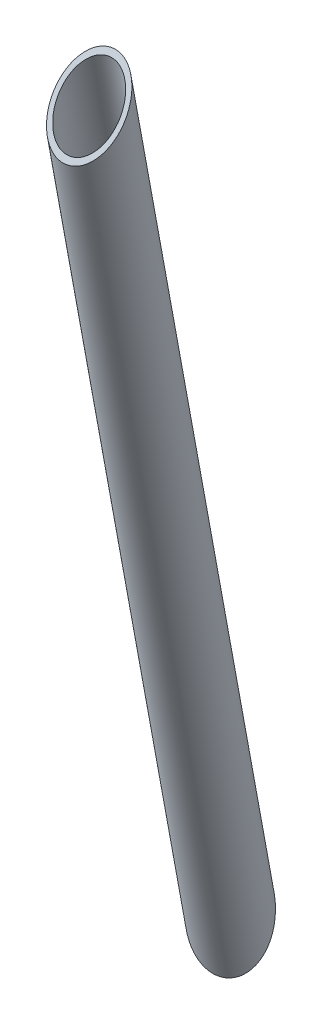
ISO-10303-21;
HEADER;
FILE_DESCRIPTION(('STEP AP214'),'2;1');
FILE_NAME('part.step','',(''),(''),'','','');
FILE_SCHEMA(('AUTOMOTIVE_DESIGN { 1 0 10303 214 1 1 1 1 }'));
ENDSEC;
DATA;
#1=APPLICATION_CONTEXT('core data for automotive mechanical design processes');
#2=APPLICATION_PROTOCOL_DEFINITION('international standard','automotive_design',2000,#1);
#3=PRODUCT_CONTEXT('',#1,'mechanical');
#4=PRODUCT('Part','Part','',(#3));
#5=PRODUCT_RELATED_PRODUCT_CATEGORY('part','',(#4));
#6=PRODUCT_DEFINITION_FORMATION('','',#4);
#7=PRODUCT_DEFINITION_CONTEXT('part definition',#1,'design');
#8=PRODUCT_DEFINITION('design','',#6,#7);
#9=PRODUCT_DEFINITION_SHAPE('','',#8);
#10=(LENGTH_UNIT() NAMED_UNIT(*) SI_UNIT(.MILLI.,.METRE.));
#11=(NAMED_UNIT(*) PLANE_ANGLE_UNIT() SI_UNIT($,.RADIAN.));
#12=(NAMED_UNIT(*) SI_UNIT($,.STERADIAN.) SOLID_ANGLE_UNIT());
#13=UNCERTAINTY_MEASURE_WITH_UNIT(LENGTH_MEASURE(1.E-05),#10,'distance_accuracy_value','');
#14=(GEOMETRIC_REPRESENTATION_CONTEXT(3) GLOBAL_UNCERTAINTY_ASSIGNED_CONTEXT((#13)) GLOBAL_UNIT_ASSIGNED_CONTEXT((#10,
#11,#12)) REPRESENTATION_CONTEXT('',''));
#15=CARTESIAN_POINT('',(0.,0.,0.));
#16=DIRECTION('',(0.,0.,1.));
#17=DIRECTION('',(1.,0.,0.));
#18=AXIS2_PLACEMENT_3D('',#15,#16,#17);
#19=CARTESIAN_POINT('',(325.,320.,-1580.));
#20=DIRECTION('',(-0.214351342090107,-0.914565726251124,-0.342962147344171));
#21=DIRECTION('',(0.,0.351123441588391,-0.936329177569045));
#22=AXIS2_PLACEMENT_3D('',#19,#20,#21);
#23=CYLINDRICAL_SURFACE('',#22,9.39999999999998);
#24=CARTESIAN_POINT('',(325.,320.,-1580.));
#25=DIRECTION('',(0.00416950723616233,0.393939167319851,0.919127057408686));
#26=DIRECTION('',(-0.2871987901008,-0.87994037819309,0.37844654284329));
#27=AXIS2_PLACEMENT_3D('',#24,#25,#26);
#28=ELLIPSE('',#27,13.8970449959828,9.39999999999998);
#29=CARTESIAN_POINT('',(321.008785491177,307.771428970469,-1574.74071136553));
#30=VERTEX_POINT('',#29);
#31=EDGE_CURVE('E53',#30,#30,#28,.T.);
#32=ORIENTED_EDGE('',*,*,#31,.T.);
#33=EDGE_LOOP('',(#32));
#34=FACE_BOUND('',#33,.T.);
#35=CARTESIAN_POINT('',(246.393439859568,-15.3879899325107,-1705.77049622469));
#36=DIRECTION('',(-0.490298311522755,-0.291983203687916,-0.821190218208958));
#37=DIRECTION('',(0.140336447675245,-0.956366902675742,0.256257739239816));
#38=AXIS2_PLACEMENT_3D('',#35,#36,#37);
#39=ELLIPSE('',#38,14.378121193455,9.39999999999998);
#40=CARTESIAN_POINT('',(248.411214312101,-29.1387491645917,-1702.08599139314));
#41=VERTEX_POINT('',#40);
#42=EDGE_CURVE('E43',#41,#41,#39,.T.);
#43=ORIENTED_EDGE('',*,*,#42,.T.);
#44=EDGE_LOOP('',(#43));
#45=FACE_BOUND('',#44,.T.);
#46=ADVANCED_FACE('F39',(#34,#45),#23,.F.);
#47=CARTESIAN_POINT('',(325.,320.,-1580.));
#48=DIRECTION('',(-0.214351342090107,-0.914565726251124,-0.342962147344171));
#49=DIRECTION('',(0.,0.351123441588391,-0.936329177569045));
#50=AXIS2_PLACEMENT_3D('',#47,#48,#49);
#51=CYLINDRICAL_SURFACE('',#50,11.);
#52=CARTESIAN_POINT('',(325.,320.,-1580.));
#53=DIRECTION('',(0.00416950723616233,0.393939167319851,0.919127057408686));
#54=DIRECTION('',(-0.2871987901008,-0.87994037819309,0.37844654284329));
#55=AXIS2_PLACEMENT_3D('',#52,#53,#54);
#56=ELLIPSE('',#55,16.2624994633842,11.);
#57=CARTESIAN_POINT('',(320.329429830101,305.689970071825,-1573.84551330009));
#58=VERTEX_POINT('',#57);
#59=EDGE_CURVE('E47',#58,#58,#56,.T.);
#60=ORIENTED_EDGE('',*,*,#59,.F.);
#61=EDGE_LOOP('',(#60));
#62=FACE_BOUND('',#61,.T.);
#63=CARTESIAN_POINT('',(246.393439859568,-15.3879899325107,-1705.77049622469));
#64=DIRECTION('',(-0.490298311522755,-0.291983203687916,-0.821190218208958));
#65=DIRECTION('',(0.140336447675245,-0.956366902675742,0.256257739239816));
#66=AXIS2_PLACEMENT_3D('',#63,#64,#65);
#67=ELLIPSE('',#66,16.8254609710644,11.);
#68=CARTESIAN_POINT('',(248.754665282745,-31.4793039274992,-1701.45884163458));
#69=VERTEX_POINT('',#68);
#70=EDGE_CURVE('E10',#69,#69,#67,.T.);
#71=ORIENTED_EDGE('',*,*,#70,.F.);
#72=EDGE_LOOP('',(#71));
#73=FACE_BOUND('',#72,.T.);
#74=ADVANCED_FACE('F67',(#62,#73),#51,.T.);
#75=CARTESIAN_POINT('',(325.,320.,-1580.));
#76=DIRECTION('',(0.00416950723616233,0.393939167319851,0.919127057408686));
#77=DIRECTION('',(0.,-0.919135046928569,0.393942591639465));
#78=AXIS2_PLACEMENT_3D('',#75,#76,#77);
#79=PLANE('',#78);
#80=ORIENTED_EDGE('',*,*,#31,.F.);
#81=EDGE_LOOP('',(#80));
#82=FACE_BOUND('',#81,.T.);
#83=ORIENTED_EDGE('',*,*,#59,.T.);
#84=EDGE_LOOP('',(#83));
#85=FACE_BOUND('',#84,.T.);
#86=ADVANCED_FACE('F62',(#82,#85),#79,.T.);
#87=CARTESIAN_POINT('',(254.068721686111,-3.32621324708998,-1714.64178299511));
#88=DIRECTION('',(-0.490298311522755,-0.291983203687916,-0.821190218208958));
#89=DIRECTION('',(-0.858605277115121,0.,0.512637277331708));
#90=AXIS2_PLACEMENT_3D('',#87,#88,#89);
#91=PLANE('',#90);
#92=ORIENTED_EDGE('',*,*,#42,.F.);
#93=EDGE_LOOP('',(#92));
#94=FACE_BOUND('',#93,.T.);
#95=ORIENTED_EDGE('',*,*,#70,.T.);
#96=EDGE_LOOP('',(#95));
#97=FACE_BOUND('',#96,.T.);
#98=ADVANCED_FACE('F41',(#94,#97),#91,.T.);
#99=CLOSED_SHELL('',(#46,#74,#86,#98));
#100=MANIFOLD_SOLID_BREP('B2',#99);
#101=ADVANCED_BREP_SHAPE_REPRESENTATION('',(#18,#100),#14);
#102=SHAPE_DEFINITION_REPRESENTATION(#9,#101);
ENDSEC;
END-ISO-10303-21;
